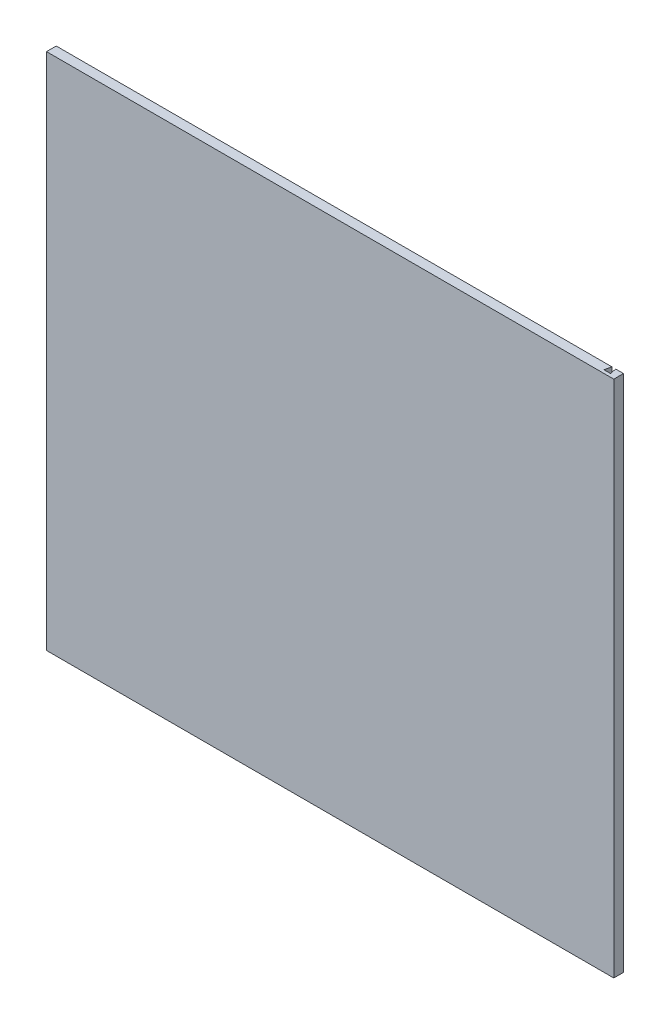
ISO-10303-21;
HEADER;
FILE_DESCRIPTION(('STEP AP214'),'2;1');
FILE_NAME('part.step','',(''),(''),'','','');
FILE_SCHEMA(('AUTOMOTIVE_DESIGN { 1 0 10303 214 1 1 1 1 }'));
ENDSEC;
DATA;
#1=APPLICATION_CONTEXT('core data for automotive mechanical design processes');
#2=APPLICATION_PROTOCOL_DEFINITION('international standard','automotive_design',2000,#1);
#3=PRODUCT_CONTEXT('',#1,'mechanical');
#4=PRODUCT('Part','Part','',(#3));
#5=PRODUCT_RELATED_PRODUCT_CATEGORY('part','',(#4));
#6=PRODUCT_DEFINITION_FORMATION('','',#4);
#7=PRODUCT_DEFINITION_CONTEXT('part definition',#1,'design');
#8=PRODUCT_DEFINITION('design','',#6,#7);
#9=PRODUCT_DEFINITION_SHAPE('','',#8);
#10=(LENGTH_UNIT() NAMED_UNIT(*) SI_UNIT(.MILLI.,.METRE.));
#11=(NAMED_UNIT(*) PLANE_ANGLE_UNIT() SI_UNIT($,.RADIAN.));
#12=(NAMED_UNIT(*) SI_UNIT($,.STERADIAN.) SOLID_ANGLE_UNIT());
#13=UNCERTAINTY_MEASURE_WITH_UNIT(LENGTH_MEASURE(1.E-05),#10,'distance_accuracy_value','');
#14=(GEOMETRIC_REPRESENTATION_CONTEXT(3) GLOBAL_UNCERTAINTY_ASSIGNED_CONTEXT((#13)) GLOBAL_UNIT_ASSIGNED_CONTEXT((#10,
#11,#12)) REPRESENTATION_CONTEXT('',''));
#15=CARTESIAN_POINT('',(0.,0.,0.));
#16=DIRECTION('',(0.,0.,1.));
#17=DIRECTION('',(1.,0.,0.));
#18=AXIS2_PLACEMENT_3D('',#15,#16,#17);
#19=CARTESIAN_POINT('',(0.,0.,0.));
#20=DIRECTION('',(0.,0.,-1.));
#21=DIRECTION('',(-1.,0.,0.));
#22=AXIS2_PLACEMENT_3D('',#19,#20,#21);
#23=PLANE('',#22);
#24=DIRECTION('',(-1.,0.,0.));
#25=VECTOR('',#24,1.);
#26=CARTESIAN_POINT('',(0.,80.,0.));
#27=LINE('',#26,#25);
#28=CARTESIAN_POINT('',(85.7,80.,0.));
#29=VERTEX_POINT('',#28);
#30=CARTESIAN_POINT('',(0.,80.,0.));
#31=VERTEX_POINT('',#30);
#32=EDGE_CURVE('E85',#29,#31,#27,.T.);
#33=ORIENTED_EDGE('',*,*,#32,.F.);
#34=DIRECTION('',(0.,1.,0.));
#35=VECTOR('',#34,1.);
#36=CARTESIAN_POINT('',(85.7,-1.41925199609236,0.));
#37=LINE('',#36,#35);
#38=CARTESIAN_POINT('',(85.7,0.,0.));
#39=VERTEX_POINT('',#38);
#40=EDGE_CURVE('E129',#39,#29,#37,.T.);
#41=ORIENTED_EDGE('',*,*,#40,.F.);
#42=DIRECTION('',(1.,0.,0.));
#43=VECTOR('',#42,1.);
#44=CARTESIAN_POINT('',(0.,0.,0.));
#45=LINE('',#44,#43);
#46=CARTESIAN_POINT('',(0.,0.,0.));
#47=VERTEX_POINT('',#46);
#48=EDGE_CURVE('E168',#47,#39,#45,.T.);
#49=ORIENTED_EDGE('',*,*,#48,.F.);
#50=DIRECTION('',(0.,-1.,0.));
#51=VECTOR('',#50,1.);
#52=CARTESIAN_POINT('',(0.,0.,0.));
#53=LINE('',#52,#51);
#54=EDGE_CURVE('E163',#31,#47,#53,.T.);
#55=ORIENTED_EDGE('',*,*,#54,.F.);
#56=EDGE_LOOP('',(#33,#41,#49,#55));
#57=FACE_BOUND('',#56,.T.);
#58=ADVANCED_FACE('F39',(#57),#23,.T.);
#59=CARTESIAN_POINT('',(0.,0.,1.5));
#60=DIRECTION('',(1.,0.,0.));
#61=DIRECTION('',(0.,0.,-1.));
#62=AXIS2_PLACEMENT_3D('',#59,#60,#61);
#63=PLANE('',#62);
#64=ORIENTED_EDGE('',*,*,#54,.T.);
#65=DIRECTION('',(0.,0.,-1.));
#66=VECTOR('',#65,1.);
#67=CARTESIAN_POINT('',(0.,0.,1.5));
#68=LINE('',#67,#66);
#69=CARTESIAN_POINT('',(0.,0.,1.5));
#70=VERTEX_POINT('',#69);
#71=EDGE_CURVE('E11',#70,#47,#68,.T.);
#72=ORIENTED_EDGE('',*,*,#71,.F.);
#73=DIRECTION('',(0.,-1.,0.));
#74=VECTOR('',#73,1.);
#75=CARTESIAN_POINT('',(0.,0.,1.5));
#76=LINE('',#75,#74);
#77=CARTESIAN_POINT('',(0.,80.,1.5));
#78=VERTEX_POINT('',#77);
#79=EDGE_CURVE('E151',#78,#70,#76,.T.);
#80=ORIENTED_EDGE('',*,*,#79,.F.);
#81=DIRECTION('',(0.,0.,-1.));
#82=VECTOR('',#81,1.);
#83=CARTESIAN_POINT('',(0.,80.,1.5));
#84=LINE('',#83,#82);
#85=EDGE_CURVE('E162',#78,#31,#84,.T.);
#86=ORIENTED_EDGE('',*,*,#85,.T.);
#87=EDGE_LOOP('',(#64,#72,#80,#86));
#88=FACE_BOUND('',#87,.T.);
#89=ADVANCED_FACE('F41',(#88),#63,.F.);
#90=CARTESIAN_POINT('',(0.,0.,1.5));
#91=DIRECTION('',(0.,1.,0.));
#92=DIRECTION('',(0.,0.,1.));
#93=AXIS2_PLACEMENT_3D('',#90,#91,#92);
#94=PLANE('',#93);
#95=DIRECTION('',(1.,0.,0.));
#96=VECTOR('',#95,1.);
#97=CARTESIAN_POINT('',(0.,0.,1.00711281811527));
#98=LINE('',#97,#96);
#99=CARTESIAN_POINT('',(85.5,0.,1.00711281811527));
#100=VERTEX_POINT('',#99);
#101=CARTESIAN_POINT('',(86.5,0.,1.00711281811527));
#102=VERTEX_POINT('',#101);
#103=EDGE_CURVE('E122',#100,#102,#98,.T.);
#104=ORIENTED_EDGE('',*,*,#103,.T.);
#105=DIRECTION('',(0.194783779543361,0.,0.980846205695268));
#106=VECTOR('',#105,1.);
#107=CARTESIAN_POINT('',(83.0257157972731,0.,-16.4878679535925));
#108=LINE('',#107,#106);
#109=CARTESIAN_POINT('',(86.3,0.,0.));
#110=VERTEX_POINT('',#109);
#111=EDGE_CURVE('E150',#110,#102,#108,.T.);
#112=ORIENTED_EDGE('',*,*,#111,.F.);
#113=CARTESIAN_POINT('',(87.5,0.,0.));
#114=VERTEX_POINT('',#113);
#115=EDGE_CURVE('E167',#110,#114,#45,.T.);
#116=ORIENTED_EDGE('',*,*,#115,.T.);
#117=DIRECTION('',(0.,0.,-1.));
#118=VECTOR('',#117,1.);
#119=CARTESIAN_POINT('',(87.5,0.,1.5));
#120=LINE('',#119,#118);
#121=CARTESIAN_POINT('',(87.5,0.,1.5));
#122=VERTEX_POINT('',#121);
#123=EDGE_CURVE('E48',#122,#114,#120,.T.);
#124=ORIENTED_EDGE('',*,*,#123,.F.);
#125=DIRECTION('',(1.,0.,0.));
#126=VECTOR('',#125,1.);
#127=CARTESIAN_POINT('',(0.,0.,1.5));
#128=LINE('',#127,#126);
#129=EDGE_CURVE('E92',#70,#122,#128,.T.);
#130=ORIENTED_EDGE('',*,*,#129,.F.);
#131=ORIENTED_EDGE('',*,*,#71,.T.);
#132=ORIENTED_EDGE('',*,*,#48,.T.);
#133=DIRECTION('',(-0.194783779543361,0.,0.980846205695268));
#134=VECTOR('',#133,1.);
#135=CARTESIAN_POINT('',(82.448480229737,0.,16.3732361949349));
#136=LINE('',#135,#134);
#137=EDGE_CURVE('E55',#39,#100,#136,.T.);
#138=ORIENTED_EDGE('',*,*,#137,.T.);
#139=EDGE_LOOP('',(#104,#112,#116,#124,#130,#131,#132,#138));
#140=FACE_BOUND('',#139,.T.);
#141=ADVANCED_FACE('F212',(#140),#94,.F.);
#142=CARTESIAN_POINT('',(87.5,0.,1.5));
#143=DIRECTION('',(-1.,0.,0.));
#144=DIRECTION('',(0.,0.,1.));
#145=AXIS2_PLACEMENT_3D('',#142,#143,#144);
#146=PLANE('',#145);
#147=DIRECTION('',(0.,1.,0.));
#148=VECTOR('',#147,1.);
#149=CARTESIAN_POINT('',(87.5,0.,0.));
#150=LINE('',#149,#148);
#151=CARTESIAN_POINT('',(87.5,80.,0.));
#152=VERTEX_POINT('',#151);
#153=EDGE_CURVE('E172',#114,#152,#150,.T.);
#154=ORIENTED_EDGE('',*,*,#153,.T.);
#155=DIRECTION('',(0.,0.,-1.));
#156=VECTOR('',#155,1.);
#157=CARTESIAN_POINT('',(87.5,80.,1.5));
#158=LINE('',#157,#156);
#159=CARTESIAN_POINT('',(87.5,80.,1.5));
#160=VERTEX_POINT('',#159);
#161=EDGE_CURVE('E179',#160,#152,#158,.T.);
#162=ORIENTED_EDGE('',*,*,#161,.F.);
#163=DIRECTION('',(0.,1.,0.));
#164=VECTOR('',#163,1.);
#165=CARTESIAN_POINT('',(87.5,0.,1.5));
#166=LINE('',#165,#164);
#167=EDGE_CURVE('E157',#122,#160,#166,.T.);
#168=ORIENTED_EDGE('',*,*,#167,.F.);
#169=ORIENTED_EDGE('',*,*,#123,.T.);
#170=EDGE_LOOP('',(#154,#162,#168,#169));
#171=FACE_BOUND('',#170,.T.);
#172=ADVANCED_FACE('F187',(#171),#146,.F.);
#173=CARTESIAN_POINT('',(0.,80.,1.5));
#174=DIRECTION('',(0.,-1.,0.));
#175=DIRECTION('',(1.,0.,0.));
#176=AXIS2_PLACEMENT_3D('',#173,#174,#175);
#177=PLANE('',#176);
#178=CARTESIAN_POINT('',(86.3,80.,0.));
#179=VERTEX_POINT('',#178);
#180=EDGE_CURVE('E154',#152,#179,#27,.T.);
#181=ORIENTED_EDGE('',*,*,#180,.T.);
#182=DIRECTION('',(-0.194783779543362,0.,-0.980846205695268));
#183=VECTOR('',#182,1.);
#184=CARTESIAN_POINT('',(83.0257157972731,80.,-16.4878679535925));
#185=LINE('',#184,#183);
#186=CARTESIAN_POINT('',(86.5,80.,1.00711281811527));
#187=VERTEX_POINT('',#186);
#188=EDGE_CURVE('E125',#187,#179,#185,.T.);
#189=ORIENTED_EDGE('',*,*,#188,.F.);
#190=DIRECTION('',(-1.,0.,0.));
#191=VECTOR('',#190,1.);
#192=CARTESIAN_POINT('',(0.,80.,1.00711281811527));
#193=LINE('',#192,#191);
#194=CARTESIAN_POINT('',(85.5,80.,1.00711281811527));
#195=VERTEX_POINT('',#194);
#196=EDGE_CURVE('E119',#187,#195,#193,.T.);
#197=ORIENTED_EDGE('',*,*,#196,.T.);
#198=DIRECTION('',(0.194783779543362,0.,-0.980846205695268));
#199=VECTOR('',#198,1.);
#200=CARTESIAN_POINT('',(82.448480229737,80.,16.3732361949349));
#201=LINE('',#200,#199);
#202=EDGE_CURVE('E127',#195,#29,#201,.T.);
#203=ORIENTED_EDGE('',*,*,#202,.T.);
#204=ORIENTED_EDGE('',*,*,#32,.T.);
#205=ORIENTED_EDGE('',*,*,#85,.F.);
#206=DIRECTION('',(-1.,0.,0.));
#207=VECTOR('',#206,1.);
#208=CARTESIAN_POINT('',(0.,80.,1.5));
#209=LINE('',#208,#207);
#210=EDGE_CURVE('E64',#160,#78,#209,.T.);
#211=ORIENTED_EDGE('',*,*,#210,.F.);
#212=ORIENTED_EDGE('',*,*,#161,.T.);
#213=EDGE_LOOP('',(#181,#189,#197,#203,#204,#205,#211,#212));
#214=FACE_BOUND('',#213,.T.);
#215=ADVANCED_FACE('F133',(#214),#177,.F.);
#216=CARTESIAN_POINT('',(0.,0.,1.5));
#217=DIRECTION('',(0.,0.,-1.));
#218=DIRECTION('',(-1.,0.,0.));
#219=AXIS2_PLACEMENT_3D('',#216,#217,#218);
#220=PLANE('',#219);
#221=ORIENTED_EDGE('',*,*,#79,.T.);
#222=ORIENTED_EDGE('',*,*,#129,.T.);
#223=ORIENTED_EDGE('',*,*,#167,.T.);
#224=ORIENTED_EDGE('',*,*,#210,.T.);
#225=EDGE_LOOP('',(#221,#222,#223,#224));
#226=FACE_BOUND('',#225,.T.);
#227=ADVANCED_FACE('F197',(#226),#220,.F.);
#228=DIRECTION('',(0.,1.,0.));
#229=VECTOR('',#228,1.);
#230=CARTESIAN_POINT('',(86.3,-1.41925199609236,0.));
#231=LINE('',#230,#229);
#232=EDGE_CURVE('E142',#110,#179,#231,.T.);
#233=ORIENTED_EDGE('',*,*,#232,.T.);
#234=ORIENTED_EDGE('',*,*,#180,.F.);
#235=ORIENTED_EDGE('',*,*,#153,.F.);
#236=ORIENTED_EDGE('',*,*,#115,.F.);
#237=EDGE_LOOP('',(#233,#234,#235,#236));
#238=FACE_BOUND('',#237,.T.);
#239=ADVANCED_FACE('F192',(#238),#23,.T.);
#240=CARTESIAN_POINT('',(0.,-1.41925199609234,1.00711281811527));
#241=DIRECTION('',(0.,0.,-1.));
#242=DIRECTION('',(-1.,0.,0.));
#243=AXIS2_PLACEMENT_3D('',#240,#241,#242);
#244=PLANE('',#243);
#245=DIRECTION('',(0.,1.,0.));
#246=VECTOR('',#245,1.);
#247=CARTESIAN_POINT('',(85.5,-1.41925199609236,1.00711281811527));
#248=LINE('',#247,#246);
#249=EDGE_CURVE('E114',#100,#195,#248,.T.);
#250=ORIENTED_EDGE('',*,*,#249,.T.);
#251=ORIENTED_EDGE('',*,*,#196,.F.);
#252=DIRECTION('',(0.,1.,0.));
#253=VECTOR('',#252,1.);
#254=CARTESIAN_POINT('',(86.5,-1.41925199609236,1.00711281811527));
#255=LINE('',#254,#253);
#256=EDGE_CURVE('E124',#102,#187,#255,.T.);
#257=ORIENTED_EDGE('',*,*,#256,.F.);
#258=ORIENTED_EDGE('',*,*,#103,.F.);
#259=EDGE_LOOP('',(#250,#251,#257,#258));
#260=FACE_BOUND('',#259,.T.);
#261=ADVANCED_FACE('F116',(#260),#244,.T.);
#262=CARTESIAN_POINT('',(83.0257157972731,-1.41925199609236,-16.4878679535925));
#263=DIRECTION('',(0.980846205695268,0.,-0.194783779543361));
#264=DIRECTION('',(-0.194783779543361,0.,-0.980846205695268));
#265=AXIS2_PLACEMENT_3D('',#262,#263,#264);
#266=PLANE('',#265);
#267=ORIENTED_EDGE('',*,*,#111,.T.);
#268=ORIENTED_EDGE('',*,*,#256,.T.);
#269=ORIENTED_EDGE('',*,*,#188,.T.);
#270=ORIENTED_EDGE('',*,*,#232,.F.);
#271=EDGE_LOOP('',(#267,#268,#269,#270));
#272=FACE_BOUND('',#271,.T.);
#273=ADVANCED_FACE('F223',(#272),#266,.F.);
#274=CARTESIAN_POINT('',(82.448480229737,-1.41925199609236,16.3732361949349));
#275=DIRECTION('',(0.980846205695268,0.,0.194783779543361));
#276=DIRECTION('',(0.194783779543361,0.,-0.980846205695268));
#277=AXIS2_PLACEMENT_3D('',#274,#275,#276);
#278=PLANE('',#277);
#279=ORIENTED_EDGE('',*,*,#40,.T.);
#280=ORIENTED_EDGE('',*,*,#202,.F.);
#281=ORIENTED_EDGE('',*,*,#249,.F.);
#282=ORIENTED_EDGE('',*,*,#137,.F.);
#283=EDGE_LOOP('',(#279,#280,#281,#282));
#284=FACE_BOUND('',#283,.T.);
#285=ADVANCED_FACE('F128',(#284),#278,.T.);
#286=CLOSED_SHELL('',(#58,#89,#141,#172,#215,#227,#239,#261,#273,#285));
#287=MANIFOLD_SOLID_BREP('B2',#286);
#288=ADVANCED_BREP_SHAPE_REPRESENTATION('',(#18,#287),#14);
#289=SHAPE_DEFINITION_REPRESENTATION(#9,#288);
ENDSEC;
END-ISO-10303-21;
